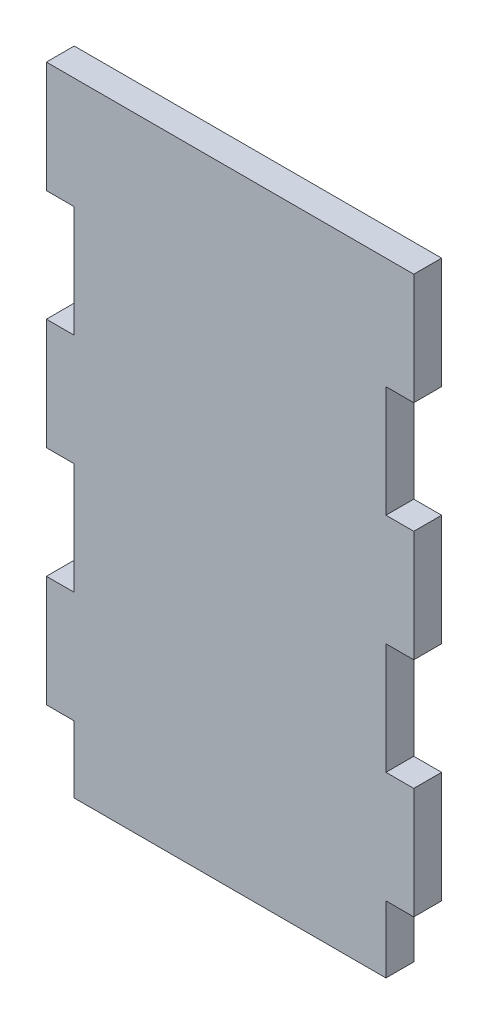
ISO-10303-21;
HEADER;
FILE_DESCRIPTION(('STEP AP214'),'2;1');
FILE_NAME('part.step','',(''),(''),'','','');
FILE_SCHEMA(('AUTOMOTIVE_DESIGN { 1 0 10303 214 1 1 1 1 }'));
ENDSEC;
DATA;
#1=APPLICATION_CONTEXT('core data for automotive mechanical design processes');
#2=APPLICATION_PROTOCOL_DEFINITION('international standard','automotive_design',2000,#1);
#3=PRODUCT_CONTEXT('',#1,'mechanical');
#4=PRODUCT('Part','Part','',(#3));
#5=PRODUCT_RELATED_PRODUCT_CATEGORY('part','',(#4));
#6=PRODUCT_DEFINITION_FORMATION('','',#4);
#7=PRODUCT_DEFINITION_CONTEXT('part definition',#1,'design');
#8=PRODUCT_DEFINITION('design','',#6,#7);
#9=PRODUCT_DEFINITION_SHAPE('','',#8);
#10=(LENGTH_UNIT() NAMED_UNIT(*) SI_UNIT(.MILLI.,.METRE.));
#11=(NAMED_UNIT(*) PLANE_ANGLE_UNIT() SI_UNIT($,.RADIAN.));
#12=(NAMED_UNIT(*) SI_UNIT($,.STERADIAN.) SOLID_ANGLE_UNIT());
#13=UNCERTAINTY_MEASURE_WITH_UNIT(LENGTH_MEASURE(1.E-05),#10,'distance_accuracy_value','');
#14=(GEOMETRIC_REPRESENTATION_CONTEXT(3) GLOBAL_UNCERTAINTY_ASSIGNED_CONTEXT((#13)) GLOBAL_UNIT_ASSIGNED_CONTEXT((#10,
#11,#12)) REPRESENTATION_CONTEXT('',''));
#15=CARTESIAN_POINT('',(0.,0.,0.));
#16=DIRECTION('',(0.,0.,1.));
#17=DIRECTION('',(1.,0.,0.));
#18=AXIS2_PLACEMENT_3D('',#15,#16,#17);
#19=CARTESIAN_POINT('',(35.56,0.,6.35));
#20=DIRECTION('',(1.,0.,0.));
#21=DIRECTION('',(0.,0.,-1.));
#22=AXIS2_PLACEMENT_3D('',#19,#20,#21);
#23=PLANE('',#22);
#24=DIRECTION('',(0.,-1.,0.));
#25=VECTOR('',#24,1.);
#26=CARTESIAN_POINT('',(35.56,0.,0.));
#27=LINE('',#26,#25);
#28=CARTESIAN_POINT('',(35.56,45.72,0.));
#29=VERTEX_POINT('',#28);
#30=CARTESIAN_POINT('',(35.56,20.32,0.));
#31=VERTEX_POINT('',#30);
#32=EDGE_CURVE('E245',#29,#31,#27,.T.);
#33=ORIENTED_EDGE('',*,*,#32,.F.);
#34=DIRECTION('',(0.,0.,-1.));
#35=VECTOR('',#34,1.);
#36=CARTESIAN_POINT('',(35.56,45.72,6.35));
#37=LINE('',#36,#35);
#38=CARTESIAN_POINT('',(35.56,45.72,6.35));
#39=VERTEX_POINT('',#38);
#40=EDGE_CURVE('E11',#39,#29,#37,.T.);
#41=ORIENTED_EDGE('',*,*,#40,.F.);
#42=DIRECTION('',(0.,-1.,0.));
#43=VECTOR('',#42,1.);
#44=CARTESIAN_POINT('',(35.56,0.,6.35));
#45=LINE('',#44,#43);
#46=CARTESIAN_POINT('',(35.56,20.32,6.35));
#47=VERTEX_POINT('',#46);
#48=EDGE_CURVE('E322',#39,#47,#45,.T.);
#49=ORIENTED_EDGE('',*,*,#48,.T.);
#50=DIRECTION('',(0.,0.,-1.));
#51=VECTOR('',#50,1.);
#52=CARTESIAN_POINT('',(35.56,20.32,6.35));
#53=LINE('',#52,#51);
#54=EDGE_CURVE('E67',#47,#31,#53,.T.);
#55=ORIENTED_EDGE('',*,*,#54,.T.);
#56=EDGE_LOOP('',(#33,#41,#49,#55));
#57=FACE_BOUND('',#56,.T.);
#58=ADVANCED_FACE('F49',(#57),#23,.T.);
#59=CARTESIAN_POINT('',(0.,45.72,6.35));
#60=DIRECTION('',(0.,1.,0.));
#61=DIRECTION('',(0.,0.,1.));
#62=AXIS2_PLACEMENT_3D('',#59,#60,#61);
#63=PLANE('',#62);
#64=DIRECTION('',(1.,0.,0.));
#65=VECTOR('',#64,1.);
#66=CARTESIAN_POINT('',(0.,45.72,0.));
#67=LINE('',#66,#65);
#68=CARTESIAN_POINT('',(41.91,45.72,0.));
#69=VERTEX_POINT('',#68);
#70=EDGE_CURVE('E248',#29,#69,#67,.T.);
#71=ORIENTED_EDGE('',*,*,#70,.T.);
#72=DIRECTION('',(0.,0.,-1.));
#73=VECTOR('',#72,1.);
#74=CARTESIAN_POINT('',(41.91,45.72,6.35));
#75=LINE('',#74,#73);
#76=CARTESIAN_POINT('',(41.91,45.72,6.35));
#77=VERTEX_POINT('',#76);
#78=EDGE_CURVE('E59',#77,#69,#75,.T.);
#79=ORIENTED_EDGE('',*,*,#78,.F.);
#80=DIRECTION('',(1.,0.,0.));
#81=VECTOR('',#80,1.);
#82=CARTESIAN_POINT('',(0.,45.72,6.35));
#83=LINE('',#82,#81);
#84=EDGE_CURVE('E407',#39,#77,#83,.T.);
#85=ORIENTED_EDGE('',*,*,#84,.F.);
#86=ORIENTED_EDGE('',*,*,#40,.T.);
#87=EDGE_LOOP('',(#71,#79,#85,#86));
#88=FACE_BOUND('',#87,.T.);
#89=ADVANCED_FACE('F51',(#88),#63,.F.);
#90=CARTESIAN_POINT('',(41.91,0.,6.35));
#91=DIRECTION('',(1.,0.,0.));
#92=DIRECTION('',(0.,0.,-1.));
#93=AXIS2_PLACEMENT_3D('',#90,#91,#92);
#94=PLANE('',#93);
#95=DIRECTION('',(0.,-1.,0.));
#96=VECTOR('',#95,1.);
#97=CARTESIAN_POINT('',(41.91,0.,0.));
#98=LINE('',#97,#96);
#99=CARTESIAN_POINT('',(41.91,71.12,0.));
#100=VERTEX_POINT('',#99);
#101=EDGE_CURVE('E254',#100,#69,#98,.T.);
#102=ORIENTED_EDGE('',*,*,#101,.F.);
#103=DIRECTION('',(0.,0.,-1.));
#104=VECTOR('',#103,1.);
#105=CARTESIAN_POINT('',(41.91,71.12,6.35));
#106=LINE('',#105,#104);
#107=CARTESIAN_POINT('',(41.91,71.12,6.35));
#108=VERTEX_POINT('',#107);
#109=EDGE_CURVE('E385',#108,#100,#106,.T.);
#110=ORIENTED_EDGE('',*,*,#109,.F.);
#111=DIRECTION('',(0.,-1.,0.));
#112=VECTOR('',#111,1.);
#113=CARTESIAN_POINT('',(41.91,0.,6.35));
#114=LINE('',#113,#112);
#115=EDGE_CURVE('E394',#108,#77,#114,.T.);
#116=ORIENTED_EDGE('',*,*,#115,.T.);
#117=ORIENTED_EDGE('',*,*,#78,.T.);
#118=EDGE_LOOP('',(#102,#110,#116,#117));
#119=FACE_BOUND('',#118,.T.);
#120=ADVANCED_FACE('F392',(#119),#94,.T.);
#121=CARTESIAN_POINT('',(0.,71.12,6.35));
#122=DIRECTION('',(0.,1.,0.));
#123=DIRECTION('',(0.,0.,1.));
#124=AXIS2_PLACEMENT_3D('',#121,#122,#123);
#125=PLANE('',#124);
#126=DIRECTION('',(1.,0.,0.));
#127=VECTOR('',#126,1.);
#128=CARTESIAN_POINT('',(0.,71.12,0.));
#129=LINE('',#128,#127);
#130=CARTESIAN_POINT('',(-41.91,71.12,0.));
#131=VERTEX_POINT('',#130);
#132=EDGE_CURVE('E258',#131,#100,#129,.T.);
#133=ORIENTED_EDGE('',*,*,#132,.F.);
#134=DIRECTION('',(0.,0.,-1.));
#135=VECTOR('',#134,1.);
#136=CARTESIAN_POINT('',(-41.91,71.12,6.35));
#137=LINE('',#136,#135);
#138=CARTESIAN_POINT('',(-41.91,71.12,6.35));
#139=VERTEX_POINT('',#138);
#140=EDGE_CURVE('E382',#139,#131,#137,.T.);
#141=ORIENTED_EDGE('',*,*,#140,.F.);
#142=DIRECTION('',(1.,0.,0.));
#143=VECTOR('',#142,1.);
#144=CARTESIAN_POINT('',(0.,71.12,6.35));
#145=LINE('',#144,#143);
#146=EDGE_CURVE('E406',#139,#108,#145,.T.);
#147=ORIENTED_EDGE('',*,*,#146,.T.);
#148=ORIENTED_EDGE('',*,*,#109,.T.);
#149=EDGE_LOOP('',(#133,#141,#147,#148));
#150=FACE_BOUND('',#149,.T.);
#151=ADVANCED_FACE('F402',(#150),#125,.T.);
#152=CARTESIAN_POINT('',(-41.91,0.,6.35));
#153=DIRECTION('',(1.,0.,0.));
#154=DIRECTION('',(0.,0.,-1.));
#155=AXIS2_PLACEMENT_3D('',#152,#153,#154);
#156=PLANE('',#155);
#157=DIRECTION('',(0.,-1.,0.));
#158=VECTOR('',#157,1.);
#159=CARTESIAN_POINT('',(-41.91,0.,0.));
#160=LINE('',#159,#158);
#161=CARTESIAN_POINT('',(-41.91,45.72,0.));
#162=VERTEX_POINT('',#161);
#163=EDGE_CURVE('E262',#131,#162,#160,.T.);
#164=ORIENTED_EDGE('',*,*,#163,.T.);
#165=DIRECTION('',(0.,0.,-1.));
#166=VECTOR('',#165,1.);
#167=CARTESIAN_POINT('',(-41.91,45.72,6.35));
#168=LINE('',#167,#166);
#169=CARTESIAN_POINT('',(-41.91,45.72,6.35));
#170=VERTEX_POINT('',#169);
#171=EDGE_CURVE('E379',#170,#162,#168,.T.);
#172=ORIENTED_EDGE('',*,*,#171,.F.);
#173=DIRECTION('',(0.,-1.,0.));
#174=VECTOR('',#173,1.);
#175=CARTESIAN_POINT('',(-41.91,0.,6.35));
#176=LINE('',#175,#174);
#177=EDGE_CURVE('E412',#139,#170,#176,.T.);
#178=ORIENTED_EDGE('',*,*,#177,.F.);
#179=ORIENTED_EDGE('',*,*,#140,.T.);
#180=EDGE_LOOP('',(#164,#172,#178,#179));
#181=FACE_BOUND('',#180,.T.);
#182=ADVANCED_FACE('F579',(#181),#156,.F.);
#183=CARTESIAN_POINT('',(0.,45.72,6.35));
#184=DIRECTION('',(0.,-1.,0.));
#185=DIRECTION('',(0.,0.,-1.));
#186=AXIS2_PLACEMENT_3D('',#183,#184,#185);
#187=PLANE('',#186);
#188=DIRECTION('',(-1.,0.,0.));
#189=VECTOR('',#188,1.);
#190=CARTESIAN_POINT('',(0.,45.72,0.));
#191=LINE('',#190,#189);
#192=CARTESIAN_POINT('',(-35.56,45.72,0.));
#193=VERTEX_POINT('',#192);
#194=EDGE_CURVE('E266',#193,#162,#191,.T.);
#195=ORIENTED_EDGE('',*,*,#194,.F.);
#196=DIRECTION('',(0.,0.,-1.));
#197=VECTOR('',#196,1.);
#198=CARTESIAN_POINT('',(-35.56,45.72,6.35));
#199=LINE('',#198,#197);
#200=CARTESIAN_POINT('',(-35.56,45.72,6.35));
#201=VERTEX_POINT('',#200);
#202=EDGE_CURVE('E376',#201,#193,#199,.T.);
#203=ORIENTED_EDGE('',*,*,#202,.F.);
#204=DIRECTION('',(-1.,0.,0.));
#205=VECTOR('',#204,1.);
#206=CARTESIAN_POINT('',(0.,45.72,6.35));
#207=LINE('',#206,#205);
#208=EDGE_CURVE('E419',#201,#170,#207,.T.);
#209=ORIENTED_EDGE('',*,*,#208,.T.);
#210=ORIENTED_EDGE('',*,*,#171,.T.);
#211=EDGE_LOOP('',(#195,#203,#209,#210));
#212=FACE_BOUND('',#211,.T.);
#213=ADVANCED_FACE('F576',(#212),#187,.T.);
#214=CARTESIAN_POINT('',(-35.56,0.,6.35));
#215=DIRECTION('',(1.,0.,0.));
#216=DIRECTION('',(0.,1.,0.));
#217=AXIS2_PLACEMENT_3D('',#214,#215,#216);
#218=PLANE('',#217);
#219=DIRECTION('',(0.,-1.,0.));
#220=VECTOR('',#219,1.);
#221=CARTESIAN_POINT('',(-35.56,0.,0.));
#222=LINE('',#221,#220);
#223=CARTESIAN_POINT('',(-35.56,20.32,0.));
#224=VERTEX_POINT('',#223);
#225=EDGE_CURVE('E270',#193,#224,#222,.T.);
#226=ORIENTED_EDGE('',*,*,#225,.T.);
#227=DIRECTION('',(0.,0.,-1.));
#228=VECTOR('',#227,1.);
#229=CARTESIAN_POINT('',(-35.56,20.32,6.35));
#230=LINE('',#229,#228);
#231=CARTESIAN_POINT('',(-35.56,20.32,6.35));
#232=VERTEX_POINT('',#231);
#233=EDGE_CURVE('E372',#232,#224,#230,.T.);
#234=ORIENTED_EDGE('',*,*,#233,.F.);
#235=DIRECTION('',(0.,-1.,0.));
#236=VECTOR('',#235,1.);
#237=CARTESIAN_POINT('',(-35.56,0.,6.35));
#238=LINE('',#237,#236);
#239=EDGE_CURVE('E423',#201,#232,#238,.T.);
#240=ORIENTED_EDGE('',*,*,#239,.F.);
#241=ORIENTED_EDGE('',*,*,#202,.T.);
#242=EDGE_LOOP('',(#226,#234,#240,#241));
#243=FACE_BOUND('',#242,.T.);
#244=ADVANCED_FACE('F556',(#243),#218,.F.);
#245=CARTESIAN_POINT('',(0.,20.32,6.35));
#246=DIRECTION('',(0.,-1.,0.));
#247=DIRECTION('',(0.,0.,-1.));
#248=AXIS2_PLACEMENT_3D('',#245,#246,#247);
#249=PLANE('',#248);
#250=DIRECTION('',(-1.,0.,0.));
#251=VECTOR('',#250,1.);
#252=CARTESIAN_POINT('',(0.,20.32,0.));
#253=LINE('',#252,#251);
#254=CARTESIAN_POINT('',(-41.91,20.32,0.));
#255=VERTEX_POINT('',#254);
#256=EDGE_CURVE('E273',#224,#255,#253,.T.);
#257=ORIENTED_EDGE('',*,*,#256,.T.);
#258=DIRECTION('',(0.,0.,-1.));
#259=VECTOR('',#258,1.);
#260=CARTESIAN_POINT('',(-41.91,20.32,6.35));
#261=LINE('',#260,#259);
#262=CARTESIAN_POINT('',(-41.91,20.32,6.35));
#263=VERTEX_POINT('',#262);
#264=EDGE_CURVE('E368',#263,#255,#261,.T.);
#265=ORIENTED_EDGE('',*,*,#264,.F.);
#266=DIRECTION('',(-1.,0.,0.));
#267=VECTOR('',#266,1.);
#268=CARTESIAN_POINT('',(0.,20.32,6.35));
#269=LINE('',#268,#267);
#270=EDGE_CURVE('E426',#232,#263,#269,.T.);
#271=ORIENTED_EDGE('',*,*,#270,.F.);
#272=ORIENTED_EDGE('',*,*,#233,.T.);
#273=EDGE_LOOP('',(#257,#265,#271,#272));
#274=FACE_BOUND('',#273,.T.);
#275=ADVANCED_FACE('F571',(#274),#249,.F.);
#276=CARTESIAN_POINT('',(-41.91,0.,6.35));
#277=DIRECTION('',(1.,0.,0.));
#278=DIRECTION('',(0.,0.,-1.));
#279=AXIS2_PLACEMENT_3D('',#276,#277,#278);
#280=PLANE('',#279);
#281=DIRECTION('',(0.,-1.,0.));
#282=VECTOR('',#281,1.);
#283=CARTESIAN_POINT('',(-41.91,0.,0.));
#284=LINE('',#283,#282);
#285=CARTESIAN_POINT('',(-41.91,-5.08,0.));
#286=VERTEX_POINT('',#285);
#287=EDGE_CURVE('E278',#255,#286,#284,.T.);
#288=ORIENTED_EDGE('',*,*,#287,.T.);
#289=DIRECTION('',(0.,0.,-1.));
#290=VECTOR('',#289,1.);
#291=CARTESIAN_POINT('',(-41.91,-5.08,6.35));
#292=LINE('',#291,#290);
#293=CARTESIAN_POINT('',(-41.91,-5.08,6.35));
#294=VERTEX_POINT('',#293);
#295=EDGE_CURVE('E365',#294,#286,#292,.T.);
#296=ORIENTED_EDGE('',*,*,#295,.F.);
#297=DIRECTION('',(0.,-1.,0.));
#298=VECTOR('',#297,1.);
#299=CARTESIAN_POINT('',(-41.91,0.,6.35));
#300=LINE('',#299,#298);
#301=EDGE_CURVE('E431',#263,#294,#300,.T.);
#302=ORIENTED_EDGE('',*,*,#301,.F.);
#303=ORIENTED_EDGE('',*,*,#264,.T.);
#304=EDGE_LOOP('',(#288,#296,#302,#303));
#305=FACE_BOUND('',#304,.T.);
#306=ADVANCED_FACE('F567',(#305),#280,.F.);
#307=CARTESIAN_POINT('',(0.,-5.08,6.35));
#308=DIRECTION('',(0.,-1.,0.));
#309=DIRECTION('',(0.,0.,-1.));
#310=AXIS2_PLACEMENT_3D('',#307,#308,#309);
#311=PLANE('',#310);
#312=DIRECTION('',(-1.,0.,0.));
#313=VECTOR('',#312,1.);
#314=CARTESIAN_POINT('',(0.,-5.08,0.));
#315=LINE('',#314,#313);
#316=CARTESIAN_POINT('',(-35.56,-5.08,0.));
#317=VERTEX_POINT('',#316);
#318=EDGE_CURVE('E282',#317,#286,#315,.T.);
#319=ORIENTED_EDGE('',*,*,#318,.F.);
#320=DIRECTION('',(0.,0.,-1.));
#321=VECTOR('',#320,1.);
#322=CARTESIAN_POINT('',(-35.56,-5.08,6.35));
#323=LINE('',#322,#321);
#324=CARTESIAN_POINT('',(-35.56,-5.08,6.35));
#325=VERTEX_POINT('',#324);
#326=EDGE_CURVE('E362',#325,#317,#323,.T.);
#327=ORIENTED_EDGE('',*,*,#326,.F.);
#328=DIRECTION('',(-1.,0.,0.));
#329=VECTOR('',#328,1.);
#330=CARTESIAN_POINT('',(0.,-5.08,6.35));
#331=LINE('',#330,#329);
#332=EDGE_CURVE('E434',#325,#294,#331,.T.);
#333=ORIENTED_EDGE('',*,*,#332,.T.);
#334=ORIENTED_EDGE('',*,*,#295,.T.);
#335=EDGE_LOOP('',(#319,#327,#333,#334));
#336=FACE_BOUND('',#335,.T.);
#337=ADVANCED_FACE('F564',(#336),#311,.T.);
#338=CARTESIAN_POINT('',(-35.56,-30.48,0.));
#339=VERTEX_POINT('',#338);
#340=EDGE_CURVE('E275',#317,#339,#222,.T.);
#341=ORIENTED_EDGE('',*,*,#340,.T.);
#342=DIRECTION('',(0.,0.,-1.));
#343=VECTOR('',#342,1.);
#344=CARTESIAN_POINT('',(-35.56,-30.48,6.35));
#345=LINE('',#344,#343);
#346=CARTESIAN_POINT('',(-35.56,-30.48,6.35));
#347=VERTEX_POINT('',#346);
#348=EDGE_CURVE('E358',#347,#339,#345,.T.);
#349=ORIENTED_EDGE('',*,*,#348,.F.);
#350=EDGE_CURVE('E428',#325,#347,#238,.T.);
#351=ORIENTED_EDGE('',*,*,#350,.F.);
#352=ORIENTED_EDGE('',*,*,#326,.T.);
#353=EDGE_LOOP('',(#341,#349,#351,#352));
#354=FACE_BOUND('',#353,.T.);
#355=ADVANCED_FACE('F523',(#354),#218,.F.);
#356=CARTESIAN_POINT('',(0.,-30.48,6.35));
#357=DIRECTION('',(0.,-1.,0.));
#358=DIRECTION('',(0.,0.,-1.));
#359=AXIS2_PLACEMENT_3D('',#356,#357,#358);
#360=PLANE('',#359);
#361=DIRECTION('',(-1.,0.,0.));
#362=VECTOR('',#361,1.);
#363=CARTESIAN_POINT('',(0.,-30.48,0.));
#364=LINE('',#363,#362);
#365=CARTESIAN_POINT('',(-41.91,-30.48,0.));
#366=VERTEX_POINT('',#365);
#367=EDGE_CURVE('E286',#339,#366,#364,.T.);
#368=ORIENTED_EDGE('',*,*,#367,.T.);
#369=DIRECTION('',(0.,0.,-1.));
#370=VECTOR('',#369,1.);
#371=CARTESIAN_POINT('',(-41.91,-30.48,6.35));
#372=LINE('',#371,#370);
#373=CARTESIAN_POINT('',(-41.91,-30.48,6.35));
#374=VERTEX_POINT('',#373);
#375=EDGE_CURVE('E354',#374,#366,#372,.T.);
#376=ORIENTED_EDGE('',*,*,#375,.F.);
#377=DIRECTION('',(-1.,0.,0.));
#378=VECTOR('',#377,1.);
#379=CARTESIAN_POINT('',(0.,-30.48,6.35));
#380=LINE('',#379,#378);
#381=EDGE_CURVE('E438',#347,#374,#380,.T.);
#382=ORIENTED_EDGE('',*,*,#381,.F.);
#383=ORIENTED_EDGE('',*,*,#348,.T.);
#384=EDGE_LOOP('',(#368,#376,#382,#383));
#385=FACE_BOUND('',#384,.T.);
#386=ADVANCED_FACE('F529',(#385),#360,.F.);
#387=CARTESIAN_POINT('',(-41.91,0.,6.35));
#388=DIRECTION('',(1.,0.,0.));
#389=DIRECTION('',(0.,0.,-1.));
#390=AXIS2_PLACEMENT_3D('',#387,#388,#389);
#391=PLANE('',#390);
#392=DIRECTION('',(0.,-1.,0.));
#393=VECTOR('',#392,1.);
#394=CARTESIAN_POINT('',(-41.91,0.,0.));
#395=LINE('',#394,#393);
#396=CARTESIAN_POINT('',(-41.91,-55.88,0.));
#397=VERTEX_POINT('',#396);
#398=EDGE_CURVE('E289',#366,#397,#395,.T.);
#399=ORIENTED_EDGE('',*,*,#398,.T.);
#400=DIRECTION('',(0.,0.,-1.));
#401=VECTOR('',#400,1.);
#402=CARTESIAN_POINT('',(-41.91,-55.88,6.35));
#403=LINE('',#402,#401);
#404=CARTESIAN_POINT('',(-41.91,-55.88,6.35));
#405=VERTEX_POINT('',#404);
#406=EDGE_CURVE('E351',#405,#397,#403,.T.);
#407=ORIENTED_EDGE('',*,*,#406,.F.);
#408=DIRECTION('',(0.,-1.,0.));
#409=VECTOR('',#408,1.);
#410=CARTESIAN_POINT('',(-41.91,0.,6.35));
#411=LINE('',#410,#409);
#412=EDGE_CURVE('E441',#374,#405,#411,.T.);
#413=ORIENTED_EDGE('',*,*,#412,.F.);
#414=ORIENTED_EDGE('',*,*,#375,.T.);
#415=EDGE_LOOP('',(#399,#407,#413,#414));
#416=FACE_BOUND('',#415,.T.);
#417=ADVANCED_FACE('F534',(#416),#391,.F.);
#418=CARTESIAN_POINT('',(0.,-55.88,6.35));
#419=DIRECTION('',(0.,-1.,0.));
#420=DIRECTION('',(0.,0.,-1.));
#421=AXIS2_PLACEMENT_3D('',#418,#419,#420);
#422=PLANE('',#421);
#423=DIRECTION('',(-1.,0.,0.));
#424=VECTOR('',#423,1.);
#425=CARTESIAN_POINT('',(0.,-55.88,0.));
#426=LINE('',#425,#424);
#427=CARTESIAN_POINT('',(-35.56,-55.88,0.));
#428=VERTEX_POINT('',#427);
#429=EDGE_CURVE('E293',#428,#397,#426,.T.);
#430=ORIENTED_EDGE('',*,*,#429,.F.);
#431=DIRECTION('',(0.,0.,-1.));
#432=VECTOR('',#431,1.);
#433=CARTESIAN_POINT('',(-35.56,-55.88,6.35));
#434=LINE('',#433,#432);
#435=CARTESIAN_POINT('',(-35.56,-55.88,6.35));
#436=VERTEX_POINT('',#435);
#437=EDGE_CURVE('E348',#436,#428,#434,.T.);
#438=ORIENTED_EDGE('',*,*,#437,.F.);
#439=DIRECTION('',(-1.,0.,0.));
#440=VECTOR('',#439,1.);
#441=CARTESIAN_POINT('',(0.,-55.88,6.35));
#442=LINE('',#441,#440);
#443=EDGE_CURVE('E444',#436,#405,#442,.T.);
#444=ORIENTED_EDGE('',*,*,#443,.T.);
#445=ORIENTED_EDGE('',*,*,#406,.T.);
#446=EDGE_LOOP('',(#430,#438,#444,#445));
#447=FACE_BOUND('',#446,.T.);
#448=ADVANCED_FACE('F555',(#447),#422,.T.);
#449=CARTESIAN_POINT('',(-35.56,-71.12,0.));
#450=VERTEX_POINT('',#449);
#451=EDGE_CURVE('E274',#428,#450,#222,.T.);
#452=ORIENTED_EDGE('',*,*,#451,.T.);
#453=DIRECTION('',(0.,0.,-1.));
#454=VECTOR('',#453,1.);
#455=CARTESIAN_POINT('',(-35.56,-71.12,6.35));
#456=LINE('',#455,#454);
#457=CARTESIAN_POINT('',(-35.56,-71.12,6.35));
#458=VERTEX_POINT('',#457);
#459=EDGE_CURVE('E344',#458,#450,#456,.T.);
#460=ORIENTED_EDGE('',*,*,#459,.F.);
#461=EDGE_CURVE('E427',#436,#458,#238,.T.);
#462=ORIENTED_EDGE('',*,*,#461,.F.);
#463=ORIENTED_EDGE('',*,*,#437,.T.);
#464=EDGE_LOOP('',(#452,#460,#462,#463));
#465=FACE_BOUND('',#464,.T.);
#466=ADVANCED_FACE('F515',(#465),#218,.F.);
#467=CARTESIAN_POINT('',(0.,-71.12,6.35));
#468=DIRECTION('',(0.,1.,0.));
#469=DIRECTION('',(0.,0.,1.));
#470=AXIS2_PLACEMENT_3D('',#467,#468,#469);
#471=PLANE('',#470);
#472=DIRECTION('',(1.,0.,0.));
#473=VECTOR('',#472,1.);
#474=CARTESIAN_POINT('',(0.,-71.12,0.));
#475=LINE('',#474,#473);
#476=CARTESIAN_POINT('',(35.56,-71.12,0.));
#477=VERTEX_POINT('',#476);
#478=EDGE_CURVE('E297',#450,#477,#475,.T.);
#479=ORIENTED_EDGE('',*,*,#478,.T.);
#480=DIRECTION('',(0.,0.,-1.));
#481=VECTOR('',#480,1.);
#482=CARTESIAN_POINT('',(35.56,-71.12,6.35));
#483=LINE('',#482,#481);
#484=CARTESIAN_POINT('',(35.56,-71.12,6.35));
#485=VERTEX_POINT('',#484);
#486=EDGE_CURVE('E341',#485,#477,#483,.T.);
#487=ORIENTED_EDGE('',*,*,#486,.F.);
#488=DIRECTION('',(1.,0.,0.));
#489=VECTOR('',#488,1.);
#490=CARTESIAN_POINT('',(0.,-71.12,6.35));
#491=LINE('',#490,#489);
#492=EDGE_CURVE('E448',#458,#485,#491,.T.);
#493=ORIENTED_EDGE('',*,*,#492,.F.);
#494=ORIENTED_EDGE('',*,*,#459,.T.);
#495=EDGE_LOOP('',(#479,#487,#493,#494));
#496=FACE_BOUND('',#495,.T.);
#497=ADVANCED_FACE('F488',(#496),#471,.F.);
#498=CARTESIAN_POINT('',(35.56,-55.88,0.));
#499=VERTEX_POINT('',#498);
#500=EDGE_CURVE('E250',#499,#477,#27,.T.);
#501=ORIENTED_EDGE('',*,*,#500,.F.);
#502=DIRECTION('',(0.,0.,-1.));
#503=VECTOR('',#502,1.);
#504=CARTESIAN_POINT('',(35.56,-55.88,6.35));
#505=LINE('',#504,#503);
#506=CARTESIAN_POINT('',(35.56,-55.88,6.35));
#507=VERTEX_POINT('',#506);
#508=EDGE_CURVE('E338',#507,#499,#505,.T.);
#509=ORIENTED_EDGE('',*,*,#508,.F.);
#510=EDGE_CURVE('E451',#507,#485,#45,.T.);
#511=ORIENTED_EDGE('',*,*,#510,.T.);
#512=ORIENTED_EDGE('',*,*,#486,.T.);
#513=EDGE_LOOP('',(#501,#509,#511,#512));
#514=FACE_BOUND('',#513,.T.);
#515=ADVANCED_FACE('F479',(#514),#23,.T.);
#516=CARTESIAN_POINT('',(0.,-55.88,6.35));
#517=DIRECTION('',(0.,1.,0.));
#518=DIRECTION('',(0.,0.,1.));
#519=AXIS2_PLACEMENT_3D('',#516,#517,#518);
#520=PLANE('',#519);
#521=DIRECTION('',(1.,0.,0.));
#522=VECTOR('',#521,1.);
#523=CARTESIAN_POINT('',(0.,-55.88,0.));
#524=LINE('',#523,#522);
#525=CARTESIAN_POINT('',(41.91,-55.88,0.));
#526=VERTEX_POINT('',#525);
#527=EDGE_CURVE('E301',#499,#526,#524,.T.);
#528=ORIENTED_EDGE('',*,*,#527,.T.);
#529=DIRECTION('',(0.,0.,-1.));
#530=VECTOR('',#529,1.);
#531=CARTESIAN_POINT('',(41.91,-55.88,6.35));
#532=LINE('',#531,#530);
#533=CARTESIAN_POINT('',(41.91,-55.88,6.35));
#534=VERTEX_POINT('',#533);
#535=EDGE_CURVE('E335',#534,#526,#532,.T.);
#536=ORIENTED_EDGE('',*,*,#535,.F.);
#537=DIRECTION('',(1.,0.,0.));
#538=VECTOR('',#537,1.);
#539=CARTESIAN_POINT('',(0.,-55.88,6.35));
#540=LINE('',#539,#538);
#541=EDGE_CURVE('E452',#507,#534,#540,.T.);
#542=ORIENTED_EDGE('',*,*,#541,.F.);
#543=ORIENTED_EDGE('',*,*,#508,.T.);
#544=EDGE_LOOP('',(#528,#536,#542,#543));
#545=FACE_BOUND('',#544,.T.);
#546=ADVANCED_FACE('F487',(#545),#520,.F.);
#547=CARTESIAN_POINT('',(41.91,0.,6.35));
#548=DIRECTION('',(1.,0.,0.));
#549=DIRECTION('',(0.,0.,-1.));
#550=AXIS2_PLACEMENT_3D('',#547,#548,#549);
#551=PLANE('',#550);
#552=DIRECTION('',(0.,-1.,0.));
#553=VECTOR('',#552,1.);
#554=CARTESIAN_POINT('',(41.91,0.,0.));
#555=LINE('',#554,#553);
#556=CARTESIAN_POINT('',(41.91,-30.48,0.));
#557=VERTEX_POINT('',#556);
#558=EDGE_CURVE('E305',#557,#526,#555,.T.);
#559=ORIENTED_EDGE('',*,*,#558,.F.);
#560=DIRECTION('',(0.,0.,-1.));
#561=VECTOR('',#560,1.);
#562=CARTESIAN_POINT('',(41.91,-30.48,6.35));
#563=LINE('',#562,#561);
#564=CARTESIAN_POINT('',(41.91,-30.48,6.35));
#565=VERTEX_POINT('',#564);
#566=EDGE_CURVE('E332',#565,#557,#563,.T.);
#567=ORIENTED_EDGE('',*,*,#566,.F.);
#568=DIRECTION('',(0.,-1.,0.));
#569=VECTOR('',#568,1.);
#570=CARTESIAN_POINT('',(41.91,0.,6.35));
#571=LINE('',#570,#569);
#572=EDGE_CURVE('E455',#565,#534,#571,.T.);
#573=ORIENTED_EDGE('',*,*,#572,.T.);
#574=ORIENTED_EDGE('',*,*,#535,.T.);
#575=EDGE_LOOP('',(#559,#567,#573,#574));
#576=FACE_BOUND('',#575,.T.);
#577=ADVANCED_FACE('F496',(#576),#551,.T.);
#578=CARTESIAN_POINT('',(0.,-30.48,6.35));
#579=DIRECTION('',(0.,1.,0.));
#580=DIRECTION('',(0.,0.,1.));
#581=AXIS2_PLACEMENT_3D('',#578,#579,#580);
#582=PLANE('',#581);
#583=DIRECTION('',(1.,0.,0.));
#584=VECTOR('',#583,1.);
#585=CARTESIAN_POINT('',(0.,-30.48,0.));
#586=LINE('',#585,#584);
#587=CARTESIAN_POINT('',(35.56,-30.48,0.));
#588=VERTEX_POINT('',#587);
#589=EDGE_CURVE('E309',#588,#557,#586,.T.);
#590=ORIENTED_EDGE('',*,*,#589,.F.);
#591=DIRECTION('',(0.,0.,-1.));
#592=VECTOR('',#591,1.);
#593=CARTESIAN_POINT('',(35.56,-30.48,6.35));
#594=LINE('',#593,#592);
#595=CARTESIAN_POINT('',(35.56,-30.48,6.35));
#596=VERTEX_POINT('',#595);
#597=EDGE_CURVE('E329',#596,#588,#594,.T.);
#598=ORIENTED_EDGE('',*,*,#597,.F.);
#599=DIRECTION('',(1.,0.,0.));
#600=VECTOR('',#599,1.);
#601=CARTESIAN_POINT('',(0.,-30.48,6.35));
#602=LINE('',#601,#600);
#603=EDGE_CURVE('E458',#596,#565,#602,.T.);
#604=ORIENTED_EDGE('',*,*,#603,.T.);
#605=ORIENTED_EDGE('',*,*,#566,.T.);
#606=EDGE_LOOP('',(#590,#598,#604,#605));
#607=FACE_BOUND('',#606,.T.);
#608=ADVANCED_FACE('F491',(#607),#582,.T.);
#609=CARTESIAN_POINT('',(35.56,-5.08,0.));
#610=VERTEX_POINT('',#609);
#611=EDGE_CURVE('E249',#610,#588,#27,.T.);
#612=ORIENTED_EDGE('',*,*,#611,.F.);
#613=DIRECTION('',(0.,0.,-1.));
#614=VECTOR('',#613,1.);
#615=CARTESIAN_POINT('',(35.56,-5.08,6.35));
#616=LINE('',#615,#614);
#617=CARTESIAN_POINT('',(35.56,-5.08,6.35));
#618=VERTEX_POINT('',#617);
#619=EDGE_CURVE('E235',#618,#610,#616,.T.);
#620=ORIENTED_EDGE('',*,*,#619,.F.);
#621=EDGE_CURVE('E223',#618,#596,#45,.T.);
#622=ORIENTED_EDGE('',*,*,#621,.T.);
#623=ORIENTED_EDGE('',*,*,#597,.T.);
#624=EDGE_LOOP('',(#612,#620,#622,#623));
#625=FACE_BOUND('',#624,.T.);
#626=ADVANCED_FACE('F480',(#625),#23,.T.);
#627=CARTESIAN_POINT('',(0.,-5.08,6.35));
#628=DIRECTION('',(0.,1.,0.));
#629=DIRECTION('',(0.,0.,1.));
#630=AXIS2_PLACEMENT_3D('',#627,#628,#629);
#631=PLANE('',#630);
#632=DIRECTION('',(1.,0.,0.));
#633=VECTOR('',#632,1.);
#634=CARTESIAN_POINT('',(0.,-5.08,0.));
#635=LINE('',#634,#633);
#636=CARTESIAN_POINT('',(41.91,-5.08,0.));
#637=VERTEX_POINT('',#636);
#638=EDGE_CURVE('E231',#610,#637,#635,.T.);
#639=ORIENTED_EDGE('',*,*,#638,.T.);
#640=DIRECTION('',(0.,0.,-1.));
#641=VECTOR('',#640,1.);
#642=CARTESIAN_POINT('',(41.91,-5.08,6.35));
#643=LINE('',#642,#641);
#644=CARTESIAN_POINT('',(41.91,-5.08,6.35));
#645=VERTEX_POINT('',#644);
#646=EDGE_CURVE('E228',#645,#637,#643,.T.);
#647=ORIENTED_EDGE('',*,*,#646,.F.);
#648=DIRECTION('',(1.,0.,0.));
#649=VECTOR('',#648,1.);
#650=CARTESIAN_POINT('',(0.,-5.08,6.35));
#651=LINE('',#650,#649);
#652=EDGE_CURVE('E214',#618,#645,#651,.T.);
#653=ORIENTED_EDGE('',*,*,#652,.F.);
#654=ORIENTED_EDGE('',*,*,#619,.T.);
#655=EDGE_LOOP('',(#639,#647,#653,#654));
#656=FACE_BOUND('',#655,.T.);
#657=ADVANCED_FACE('F229',(#656),#631,.F.);
#658=CARTESIAN_POINT('',(41.91,0.,6.35));
#659=DIRECTION('',(1.,0.,0.));
#660=DIRECTION('',(0.,0.,-1.));
#661=AXIS2_PLACEMENT_3D('',#658,#659,#660);
#662=PLANE('',#661);
#663=DIRECTION('',(0.,-1.,0.));
#664=VECTOR('',#663,1.);
#665=CARTESIAN_POINT('',(41.91,0.,0.));
#666=LINE('',#665,#664);
#667=CARTESIAN_POINT('',(41.91,20.32,0.));
#668=VERTEX_POINT('',#667);
#669=EDGE_CURVE('E315',#668,#637,#666,.T.);
#670=ORIENTED_EDGE('',*,*,#669,.F.);
#671=DIRECTION('',(0.,0.,-1.));
#672=VECTOR('',#671,1.);
#673=CARTESIAN_POINT('',(41.91,20.32,6.35));
#674=LINE('',#673,#672);
#675=CARTESIAN_POINT('',(41.91,20.32,6.35));
#676=VERTEX_POINT('',#675);
#677=EDGE_CURVE('E140',#676,#668,#674,.T.);
#678=ORIENTED_EDGE('',*,*,#677,.F.);
#679=DIRECTION('',(0.,-1.,0.));
#680=VECTOR('',#679,1.);
#681=CARTESIAN_POINT('',(41.91,0.,6.35));
#682=LINE('',#681,#680);
#683=EDGE_CURVE('E220',#676,#645,#682,.T.);
#684=ORIENTED_EDGE('',*,*,#683,.T.);
#685=ORIENTED_EDGE('',*,*,#646,.T.);
#686=EDGE_LOOP('',(#670,#678,#684,#685));
#687=FACE_BOUND('',#686,.T.);
#688=ADVANCED_FACE('F237',(#687),#662,.T.);
#689=CARTESIAN_POINT('',(0.,20.32,6.35));
#690=DIRECTION('',(0.,1.,0.));
#691=DIRECTION('',(0.,0.,1.));
#692=AXIS2_PLACEMENT_3D('',#689,#690,#691);
#693=PLANE('',#692);
#694=DIRECTION('',(1.,0.,0.));
#695=VECTOR('',#694,1.);
#696=CARTESIAN_POINT('',(0.,20.32,0.));
#697=LINE('',#696,#695);
#698=EDGE_CURVE('E318',#31,#668,#697,.T.);
#699=ORIENTED_EDGE('',*,*,#698,.F.);
#700=ORIENTED_EDGE('',*,*,#54,.F.);
#701=DIRECTION('',(1.,0.,0.));
#702=VECTOR('',#701,1.);
#703=CARTESIAN_POINT('',(0.,20.32,6.35));
#704=LINE('',#703,#702);
#705=EDGE_CURVE('E239',#47,#676,#704,.T.);
#706=ORIENTED_EDGE('',*,*,#705,.T.);
#707=ORIENTED_EDGE('',*,*,#677,.T.);
#708=EDGE_LOOP('',(#699,#700,#706,#707));
#709=FACE_BOUND('',#708,.T.);
#710=ADVANCED_FACE('F467',(#709),#693,.T.);
#711=CARTESIAN_POINT('',(0.,0.,6.35));
#712=DIRECTION('',(0.,0.,1.));
#713=DIRECTION('',(1.,0.,0.));
#714=AXIS2_PLACEMENT_3D('',#711,#712,#713);
#715=PLANE('',#714);
#716=ORIENTED_EDGE('',*,*,#48,.F.);
#717=ORIENTED_EDGE('',*,*,#84,.T.);
#718=ORIENTED_EDGE('',*,*,#115,.F.);
#719=ORIENTED_EDGE('',*,*,#146,.F.);
#720=ORIENTED_EDGE('',*,*,#177,.T.);
#721=ORIENTED_EDGE('',*,*,#208,.F.);
#722=ORIENTED_EDGE('',*,*,#239,.T.);
#723=ORIENTED_EDGE('',*,*,#270,.T.);
#724=ORIENTED_EDGE('',*,*,#301,.T.);
#725=ORIENTED_EDGE('',*,*,#332,.F.);
#726=ORIENTED_EDGE('',*,*,#350,.T.);
#727=ORIENTED_EDGE('',*,*,#381,.T.);
#728=ORIENTED_EDGE('',*,*,#412,.T.);
#729=ORIENTED_EDGE('',*,*,#443,.F.);
#730=ORIENTED_EDGE('',*,*,#461,.T.);
#731=ORIENTED_EDGE('',*,*,#492,.T.);
#732=ORIENTED_EDGE('',*,*,#510,.F.);
#733=ORIENTED_EDGE('',*,*,#541,.T.);
#734=ORIENTED_EDGE('',*,*,#572,.F.);
#735=ORIENTED_EDGE('',*,*,#603,.F.);
#736=ORIENTED_EDGE('',*,*,#621,.F.);
#737=ORIENTED_EDGE('',*,*,#652,.T.);
#738=ORIENTED_EDGE('',*,*,#683,.F.);
#739=ORIENTED_EDGE('',*,*,#705,.F.);
#740=EDGE_LOOP('',(#716,#717,#718,#719,#720,#721,#722,#723,#724,#725,#726,#727,#728,#729,#730,
#731,#732,#733,#734,#735,#736,#737,#738,#739));
#741=FACE_BOUND('',#740,.T.);
#742=ADVANCED_FACE('F217',(#741),#715,.T.);
#743=CARTESIAN_POINT('',(0.,0.,0.));
#744=DIRECTION('',(0.,0.,1.));
#745=DIRECTION('',(1.,0.,0.));
#746=AXIS2_PLACEMENT_3D('',#743,#744,#745);
#747=PLANE('',#746);
#748=ORIENTED_EDGE('',*,*,#32,.T.);
#749=ORIENTED_EDGE('',*,*,#698,.T.);
#750=ORIENTED_EDGE('',*,*,#669,.T.);
#751=ORIENTED_EDGE('',*,*,#638,.F.);
#752=ORIENTED_EDGE('',*,*,#611,.T.);
#753=ORIENTED_EDGE('',*,*,#589,.T.);
#754=ORIENTED_EDGE('',*,*,#558,.T.);
#755=ORIENTED_EDGE('',*,*,#527,.F.);
#756=ORIENTED_EDGE('',*,*,#500,.T.);
#757=ORIENTED_EDGE('',*,*,#478,.F.);
#758=ORIENTED_EDGE('',*,*,#451,.F.);
#759=ORIENTED_EDGE('',*,*,#429,.T.);
#760=ORIENTED_EDGE('',*,*,#398,.F.);
#761=ORIENTED_EDGE('',*,*,#367,.F.);
#762=ORIENTED_EDGE('',*,*,#340,.F.);
#763=ORIENTED_EDGE('',*,*,#318,.T.);
#764=ORIENTED_EDGE('',*,*,#287,.F.);
#765=ORIENTED_EDGE('',*,*,#256,.F.);
#766=ORIENTED_EDGE('',*,*,#225,.F.);
#767=ORIENTED_EDGE('',*,*,#194,.T.);
#768=ORIENTED_EDGE('',*,*,#163,.F.);
#769=ORIENTED_EDGE('',*,*,#132,.T.);
#770=ORIENTED_EDGE('',*,*,#101,.T.);
#771=ORIENTED_EDGE('',*,*,#70,.F.);
#772=EDGE_LOOP('',(#748,#749,#750,#751,#752,#753,#754,#755,#756,#757,#758,#759,#760,#761,#762,
#763,#764,#765,#766,#767,#768,#769,#770,#771));
#773=FACE_BOUND('',#772,.T.);
#774=ADVANCED_FACE('F398',(#773),#747,.F.);
#775=CLOSED_SHELL('',(#58,#89,#120,#151,#182,#213,#244,#275,#306,#337,#355,#386,#417,#448,#466,
#497,#515,#546,#577,#608,#626,#657,#688,#710,#742,#774));
#776=MANIFOLD_SOLID_BREP('B2',#775);
#777=ADVANCED_BREP_SHAPE_REPRESENTATION('',(#18,#776),#14);
#778=SHAPE_DEFINITION_REPRESENTATION(#9,#777);
ENDSEC;
END-ISO-10303-21;
